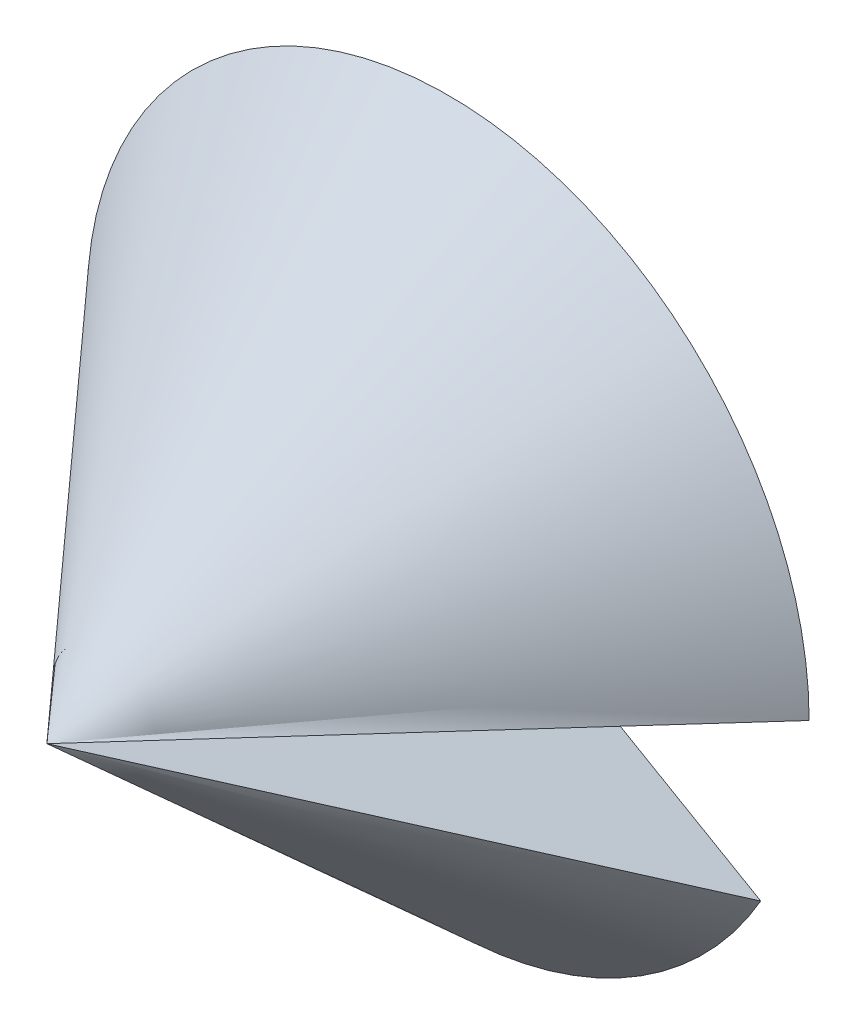
ISO-10303-21;
HEADER;
FILE_DESCRIPTION(('STEP AP214'),'2;1');
FILE_NAME('part.step','',(''),(''),'','','');
FILE_SCHEMA(('AUTOMOTIVE_DESIGN { 1 0 10303 214 1 1 1 1 }'));
ENDSEC;
DATA;
#1=APPLICATION_CONTEXT('core data for automotive mechanical design processes');
#2=APPLICATION_PROTOCOL_DEFINITION('international standard','automotive_design',2000,#1);
#3=PRODUCT_CONTEXT('',#1,'mechanical');
#4=PRODUCT('Part','Part','',(#3));
#5=PRODUCT_RELATED_PRODUCT_CATEGORY('part','',(#4));
#6=PRODUCT_DEFINITION_FORMATION('','',#4);
#7=PRODUCT_DEFINITION_CONTEXT('part definition',#1,'design');
#8=PRODUCT_DEFINITION('design','',#6,#7);
#9=PRODUCT_DEFINITION_SHAPE('','',#8);
#10=(LENGTH_UNIT() NAMED_UNIT(*) SI_UNIT(.MILLI.,.METRE.));
#11=(NAMED_UNIT(*) PLANE_ANGLE_UNIT() SI_UNIT($,.RADIAN.));
#12=(NAMED_UNIT(*) SI_UNIT($,.STERADIAN.) SOLID_ANGLE_UNIT());
#13=UNCERTAINTY_MEASURE_WITH_UNIT(LENGTH_MEASURE(1.E-05),#10,'distance_accuracy_value','');
#14=(GEOMETRIC_REPRESENTATION_CONTEXT(3) GLOBAL_UNCERTAINTY_ASSIGNED_CONTEXT((#13)) GLOBAL_UNIT_ASSIGNED_CONTEXT((#10,
#11,#12)) REPRESENTATION_CONTEXT('',''));
#15=CARTESIAN_POINT('',(0.,0.,0.));
#16=DIRECTION('',(0.,0.,1.));
#17=DIRECTION('',(1.,0.,0.));
#18=AXIS2_PLACEMENT_3D('',#15,#16,#17);
#19=CARTESIAN_POINT('',(0.,0.,0.));
#20=DIRECTION('',(-0.500000000000001,-0.866025403784438,0.));
#21=DIRECTION('',(0.,0.,-1.));
#22=AXIS2_PLACEMENT_3D('',#19,#20,#21);
#23=PLANE('',#22);
#24=DIRECTION('',(-0.866025403784438,0.500000000000001,0.));
#25=VECTOR('',#24,1.);
#26=CARTESIAN_POINT('',(0.,0.,10.));
#27=LINE('',#26,#25);
#28=CARTESIAN_POINT('',(1.73205080756888,-1.,10.));
#29=VERTEX_POINT('',#28);
#30=CARTESIAN_POINT('',(0.,0.,10.));
#31=VERTEX_POINT('',#30);
#32=EDGE_CURVE('E62',#29,#31,#27,.T.);
#33=ORIENTED_EDGE('',*,*,#32,.F.);
#34=DIRECTION('',(0.,0.,-1.));
#35=VECTOR('',#34,1.);
#36=CARTESIAN_POINT('',(1.73205080756888,-1.,10.));
#37=LINE('',#36,#35);
#38=CARTESIAN_POINT('',(1.73205080756888,-1.,0.));
#39=VERTEX_POINT('',#38);
#40=EDGE_CURVE('E108',#29,#39,#37,.T.);
#41=ORIENTED_EDGE('',*,*,#40,.T.);
#42=DIRECTION('',(-0.866025403784438,0.500000000000001,0.));
#43=VECTOR('',#42,1.);
#44=CARTESIAN_POINT('',(20.5417334655142,-11.8597753459362,0.));
#45=LINE('',#44,#43);
#46=CARTESIAN_POINT('',(20.5417334655142,-11.8597753459362,0.));
#47=VERTEX_POINT('',#46);
#48=EDGE_CURVE('E98',#47,#39,#45,.T.);
#49=ORIENTED_EDGE('',*,*,#48,.F.);
#50=DIRECTION('',(0.371185275028236,-0.214303918456778,-0.903490632013572));
#51=VECTOR('',#50,1.);
#52=CARTESIAN_POINT('',(0.,0.,50.));
#53=LINE('',#52,#51);
#54=CARTESIAN_POINT('',(0.,0.,50.));
#55=VERTEX_POINT('',#54);
#56=EDGE_CURVE('E106',#55,#47,#53,.T.);
#57=ORIENTED_EDGE('',*,*,#56,.F.);
#58=DIRECTION('',(0.,0.,1.));
#59=VECTOR('',#58,1.);
#60=CARTESIAN_POINT('',(0.,0.,0.));
#61=LINE('',#60,#59);
#62=EDGE_CURVE('E104',#31,#55,#61,.T.);
#63=ORIENTED_EDGE('',*,*,#62,.F.);
#64=EDGE_LOOP('',(#33,#41,#49,#57,#63));
#65=FACE_BOUND('',#64,.T.);
#66=ADVANCED_FACE('F47',(#65),#23,.T.);
#67=CARTESIAN_POINT('',(0.,0.,0.));
#68=DIRECTION('',(0.,-1.,0.));
#69=DIRECTION('',(0.,0.,-1.));
#70=AXIS2_PLACEMENT_3D('',#67,#68,#69);
#71=PLANE('',#70);
#72=DIRECTION('',(0.,0.,-1.));
#73=VECTOR('',#72,1.);
#74=CARTESIAN_POINT('',(2.,0.,10.));
#75=LINE('',#74,#73);
#76=CARTESIAN_POINT('',(2.,0.,10.));
#77=VERTEX_POINT('',#76);
#78=CARTESIAN_POINT('',(2.,0.,0.));
#79=VERTEX_POINT('',#78);
#80=EDGE_CURVE('E12',#77,#79,#75,.T.);
#81=ORIENTED_EDGE('',*,*,#80,.F.);
#82=DIRECTION('',(-1.,0.,0.));
#83=VECTOR('',#82,1.);
#84=CARTESIAN_POINT('',(0.,0.,10.));
#85=LINE('',#84,#83);
#86=EDGE_CURVE('E55',#77,#31,#85,.T.);
#87=ORIENTED_EDGE('',*,*,#86,.T.);
#88=ORIENTED_EDGE('',*,*,#62,.T.);
#89=DIRECTION('',(0.428607836913555,0.,-0.903490632013572));
#90=VECTOR('',#89,1.);
#91=CARTESIAN_POINT('',(0.,0.,50.));
#92=LINE('',#91,#90);
#93=CARTESIAN_POINT('',(23.7195506918724,0.,0.));
#94=VERTEX_POINT('',#93);
#95=EDGE_CURVE('E103',#55,#94,#92,.T.);
#96=ORIENTED_EDGE('',*,*,#95,.T.);
#97=DIRECTION('',(-1.,0.,0.));
#98=VECTOR('',#97,1.);
#99=CARTESIAN_POINT('',(23.7195506918724,0.,0.));
#100=LINE('',#99,#98);
#101=EDGE_CURVE('E96',#94,#79,#100,.T.);
#102=ORIENTED_EDGE('',*,*,#101,.T.);
#103=EDGE_LOOP('',(#81,#87,#88,#96,#102));
#104=FACE_BOUND('',#103,.T.);
#105=ADVANCED_FACE('F101',(#104),#71,.F.);
#106=CARTESIAN_POINT('',(20.5417334655142,-11.8597753459362,0.));
#107=DIRECTION('',(0.,0.,-1.));
#108=DIRECTION('',(-1.,0.,0.));
#109=AXIS2_PLACEMENT_3D('',#106,#107,#108);
#110=PLANE('',#109);
#111=ORIENTED_EDGE('',*,*,#48,.T.);
#112=CARTESIAN_POINT('',(0.,0.,0.));
#113=DIRECTION('',(0.,0.,1.));
#114=DIRECTION('',(1.,0.,0.));
#115=AXIS2_PLACEMENT_3D('',#112,#113,#114);
#116=CIRCLE('',#115,2.);
#117=EDGE_CURVE('E91',#39,#79,#116,.T.);
#118=ORIENTED_EDGE('',*,*,#117,.T.);
#119=ORIENTED_EDGE('',*,*,#101,.F.);
#120=CARTESIAN_POINT('',(0.,0.,0.));
#121=DIRECTION('',(0.,0.,1.));
#122=DIRECTION('',(1.,0.,0.));
#123=AXIS2_PLACEMENT_3D('',#120,#121,#122);
#124=CIRCLE('',#123,23.7195506918724);
#125=EDGE_CURVE('E70',#47,#94,#124,.T.);
#126=ORIENTED_EDGE('',*,*,#125,.F.);
#127=EDGE_LOOP('',(#111,#118,#119,#126));
#128=FACE_BOUND('',#127,.T.);
#129=ADVANCED_FACE('F49',(#128),#110,.T.);
#130=CARTESIAN_POINT('',(0.,0.,50.));
#131=DIRECTION('',(0.,0.,-1.));
#132=DIRECTION('',(-1.,0.,0.));
#133=AXIS2_PLACEMENT_3D('',#130,#131,#132);
#134=CONICAL_SURFACE('',#133,0.,0.442951341109212);
#135=ORIENTED_EDGE('',*,*,#56,.T.);
#136=ORIENTED_EDGE('',*,*,#125,.T.);
#137=ORIENTED_EDGE('',*,*,#95,.F.);
#138=EDGE_LOOP('',(#135,#136,#137));
#139=FACE_BOUND('',#138,.T.);
#140=ADVANCED_FACE('F118',(#139),#134,.T.);
#141=CARTESIAN_POINT('',(0.,0.,10.));
#142=DIRECTION('',(0.,0.,-1.));
#143=DIRECTION('',(-1.,0.,0.));
#144=AXIS2_PLACEMENT_3D('',#141,#142,#143);
#145=CYLINDRICAL_SURFACE('',#144,2.);
#146=CARTESIAN_POINT('',(0.,0.,10.));
#147=DIRECTION('',(0.,0.,1.));
#148=DIRECTION('',(1.,0.,0.));
#149=AXIS2_PLACEMENT_3D('',#146,#147,#148);
#150=CIRCLE('',#149,2.);
#151=EDGE_CURVE('E93',#29,#77,#150,.T.);
#152=ORIENTED_EDGE('',*,*,#151,.T.);
#153=ORIENTED_EDGE('',*,*,#80,.T.);
#154=ORIENTED_EDGE('',*,*,#117,.F.);
#155=ORIENTED_EDGE('',*,*,#40,.F.);
#156=EDGE_LOOP('',(#152,#153,#154,#155));
#157=FACE_BOUND('',#156,.T.);
#158=ADVANCED_FACE('F90',(#157),#145,.F.);
#159=CARTESIAN_POINT('',(0.,0.,10.));
#160=DIRECTION('',(0.,0.,1.));
#161=DIRECTION('',(1.,0.,0.));
#162=AXIS2_PLACEMENT_3D('',#159,#160,#161);
#163=PLANE('',#162);
#164=ORIENTED_EDGE('',*,*,#32,.T.);
#165=ORIENTED_EDGE('',*,*,#86,.F.);
#166=ORIENTED_EDGE('',*,*,#151,.F.);
#167=EDGE_LOOP('',(#164,#165,#166));
#168=FACE_BOUND('',#167,.T.);
#169=ADVANCED_FACE('F124',(#168),#163,.F.);
#170=CLOSED_SHELL('',(#66,#105,#129,#140,#158,#169));
#171=MANIFOLD_SOLID_BREP('B2',#170);
#172=CARTESIAN_POINT('',(0.,0.,0.));
#173=DIRECTION('',(0.499999999999989,0.866025403784445,0.));
#174=DIRECTION('',(0.,0.,1.));
#175=AXIS2_PLACEMENT_3D('',#172,#173,#174);
#176=PLANE('',#175);
#177=DIRECTION('',(-0.866025403784445,0.499999999999989,0.));
#178=VECTOR('',#177,1.);
#179=CARTESIAN_POINT('',(0.,0.,0.));
#180=LINE('',#179,#178);
#181=CARTESIAN_POINT('',(38.9711431703,-22.4999999999995,0.));
#182=VERTEX_POINT('',#181);
#183=CARTESIAN_POINT('',(1.73205080756889,-0.999999999999972,0.));
#184=VERTEX_POINT('',#183);
#185=EDGE_CURVE('E235',#182,#184,#180,.T.);
#186=ORIENTED_EDGE('',*,*,#185,.T.);
#187=DIRECTION('',(0.,0.,-1.));
#188=VECTOR('',#187,1.);
#189=CARTESIAN_POINT('',(1.73205080756889,-0.999999999999973,10.));
#190=LINE('',#189,#188);
#191=CARTESIAN_POINT('',(1.73205080756889,-0.999999999999973,10.));
#192=VERTEX_POINT('',#191);
#193=EDGE_CURVE('E220',#184,#192,#190,.F.);
#194=ORIENTED_EDGE('',*,*,#193,.T.);
#195=DIRECTION('',(0.866025403784445,-0.499999999999989,0.));
#196=VECTOR('',#195,1.);
#197=CARTESIAN_POINT('',(0.,0.,10.));
#198=LINE('',#197,#196);
#199=CARTESIAN_POINT('',(0.,0.,10.));
#200=VERTEX_POINT('',#199);
#201=EDGE_CURVE('E262',#200,#192,#198,.T.);
#202=ORIENTED_EDGE('',*,*,#201,.F.);
#203=DIRECTION('',(0.,0.,1.));
#204=VECTOR('',#203,1.);
#205=CARTESIAN_POINT('',(0.,0.,0.));
#206=LINE('',#205,#204);
#207=CARTESIAN_POINT('',(0.,0.,50.));
#208=VERTEX_POINT('',#207);
#209=EDGE_CURVE('E196',#200,#208,#206,.T.);
#210=ORIENTED_EDGE('',*,*,#209,.T.);
#211=DIRECTION('',(0.579340451820885,-0.334482365811217,-0.743294146247166));
#212=VECTOR('',#211,1.);
#213=CARTESIAN_POINT('',(21.5310183261326,-12.4309392265191,22.3756906077348));
#214=LINE('',#213,#212);
#215=EDGE_CURVE('E232',#208,#182,#214,.T.);
#216=ORIENTED_EDGE('',*,*,#215,.T.);
#217=EDGE_LOOP('',(#186,#194,#202,#210,#216));
#218=FACE_BOUND('',#217,.T.);
#219=ADVANCED_FACE('F174',(#218),#176,.T.);
#220=CARTESIAN_POINT('',(0.,0.,0.));
#221=DIRECTION('',(0.,1.,0.));
#222=DIRECTION('',(0.,0.,1.));
#223=AXIS2_PLACEMENT_3D('',#220,#221,#222);
#224=PLANE('',#223);
#225=DIRECTION('',(0.,0.,-1.));
#226=VECTOR('',#225,1.);
#227=CARTESIAN_POINT('',(2.,0.,10.));
#228=LINE('',#227,#226);
#229=CARTESIAN_POINT('',(2.,0.,0.));
#230=VERTEX_POINT('',#229);
#231=CARTESIAN_POINT('',(2.,0.,10.));
#232=VERTEX_POINT('',#231);
#233=EDGE_CURVE('E45',#230,#232,#228,.F.);
#234=ORIENTED_EDGE('',*,*,#233,.F.);
#235=DIRECTION('',(-1.,0.,0.));
#236=VECTOR('',#235,1.);
#237=CARTESIAN_POINT('',(0.,0.,0.));
#238=LINE('',#237,#236);
#239=CARTESIAN_POINT('',(45.,0.,0.));
#240=VERTEX_POINT('',#239);
#241=EDGE_CURVE('E229',#240,#230,#238,.T.);
#242=ORIENTED_EDGE('',*,*,#241,.F.);
#243=DIRECTION('',(0.66896473162245,0.,-0.743294146247166));
#244=VECTOR('',#243,1.);
#245=CARTESIAN_POINT('',(24.8618784530387,0.,22.3756906077348));
#246=LINE('',#245,#244);
#247=EDGE_CURVE('E233',#208,#240,#246,.T.);
#248=ORIENTED_EDGE('',*,*,#247,.F.);
#249=ORIENTED_EDGE('',*,*,#209,.F.);
#250=DIRECTION('',(1.,0.,0.));
#251=VECTOR('',#250,1.);
#252=CARTESIAN_POINT('',(0.,0.,10.));
#253=LINE('',#252,#251);
#254=EDGE_CURVE('E182',#200,#232,#253,.T.);
#255=ORIENTED_EDGE('',*,*,#254,.T.);
#256=EDGE_LOOP('',(#234,#242,#248,#249,#255));
#257=FACE_BOUND('',#256,.T.);
#258=ADVANCED_FACE('F228',(#257),#224,.F.);
#259=CARTESIAN_POINT('',(0.,0.,50.));
#260=DIRECTION('',(0.,0.,-1.));
#261=DIRECTION('',(-1.,0.,0.));
#262=AXIS2_PLACEMENT_3D('',#259,#260,#261);
#263=CONICAL_SURFACE('',#262,0.,0.732815101786507);
#264=CARTESIAN_POINT('',(0.,0.,0.));
#265=DIRECTION('',(0.,0.,-1.));
#266=DIRECTION('',(-1.,0.,0.));
#267=AXIS2_PLACEMENT_3D('',#264,#265,#266);
#268=CIRCLE('',#267,45.);
#269=EDGE_CURVE('E230',#182,#240,#268,.T.);
#270=ORIENTED_EDGE('',*,*,#269,.F.);
#271=ORIENTED_EDGE('',*,*,#215,.F.);
#272=ORIENTED_EDGE('',*,*,#247,.T.);
#273=EDGE_LOOP('',(#270,#271,#272));
#274=FACE_BOUND('',#273,.T.);
#275=ADVANCED_FACE('F244',(#274),#263,.T.);
#276=CARTESIAN_POINT('',(0.,0.,0.));
#277=DIRECTION('',(0.,0.,1.));
#278=DIRECTION('',(1.,0.,0.));
#279=AXIS2_PLACEMENT_3D('',#276,#277,#278);
#280=PLANE('',#279);
#281=CARTESIAN_POINT('',(0.,0.,0.));
#282=DIRECTION('',(0.,0.,1.));
#283=DIRECTION('',(1.,0.,0.));
#284=AXIS2_PLACEMENT_3D('',#281,#282,#283);
#285=CIRCLE('',#284,2.);
#286=EDGE_CURVE('E215',#230,#184,#285,.T.);
#287=ORIENTED_EDGE('',*,*,#286,.T.);
#288=ORIENTED_EDGE('',*,*,#185,.F.);
#289=ORIENTED_EDGE('',*,*,#269,.T.);
#290=ORIENTED_EDGE('',*,*,#241,.T.);
#291=EDGE_LOOP('',(#287,#288,#289,#290));
#292=FACE_BOUND('',#291,.T.);
#293=ADVANCED_FACE('F176',(#292),#280,.F.);
#294=CARTESIAN_POINT('',(0.,0.,10.));
#295=DIRECTION('',(0.,0.,-1.));
#296=DIRECTION('',(-1.,0.,0.));
#297=AXIS2_PLACEMENT_3D('',#294,#295,#296);
#298=CYLINDRICAL_SURFACE('',#297,2.);
#299=ORIENTED_EDGE('',*,*,#286,.F.);
#300=ORIENTED_EDGE('',*,*,#233,.T.);
#301=CARTESIAN_POINT('',(0.,0.,10.));
#302=DIRECTION('',(0.,0.,1.));
#303=DIRECTION('',(1.,0.,0.));
#304=AXIS2_PLACEMENT_3D('',#301,#302,#303);
#305=CIRCLE('',#304,2.);
#306=EDGE_CURVE('E189',#232,#192,#305,.T.);
#307=ORIENTED_EDGE('',*,*,#306,.T.);
#308=ORIENTED_EDGE('',*,*,#193,.F.);
#309=EDGE_LOOP('',(#299,#300,#307,#308));
#310=FACE_BOUND('',#309,.T.);
#311=ADVANCED_FACE('F217',(#310),#298,.F.);
#312=CARTESIAN_POINT('',(0.,0.,10.));
#313=DIRECTION('',(0.,0.,1.));
#314=DIRECTION('',(1.,0.,0.));
#315=AXIS2_PLACEMENT_3D('',#312,#313,#314);
#316=PLANE('',#315);
#317=ORIENTED_EDGE('',*,*,#201,.T.);
#318=ORIENTED_EDGE('',*,*,#306,.F.);
#319=ORIENTED_EDGE('',*,*,#254,.F.);
#320=EDGE_LOOP('',(#317,#318,#319));
#321=FACE_BOUND('',#320,.T.);
#322=ADVANCED_FACE('F258',(#321),#316,.F.);
#323=CLOSED_SHELL('',(#219,#258,#275,#293,#311,#322));
#324=MANIFOLD_SOLID_BREP('B6',#323);
#325=ADVANCED_BREP_SHAPE_REPRESENTATION('',(#18,#171,#324),#14);
#326=SHAPE_DEFINITION_REPRESENTATION(#9,#325);
ENDSEC;
END-ISO-10303-21;
